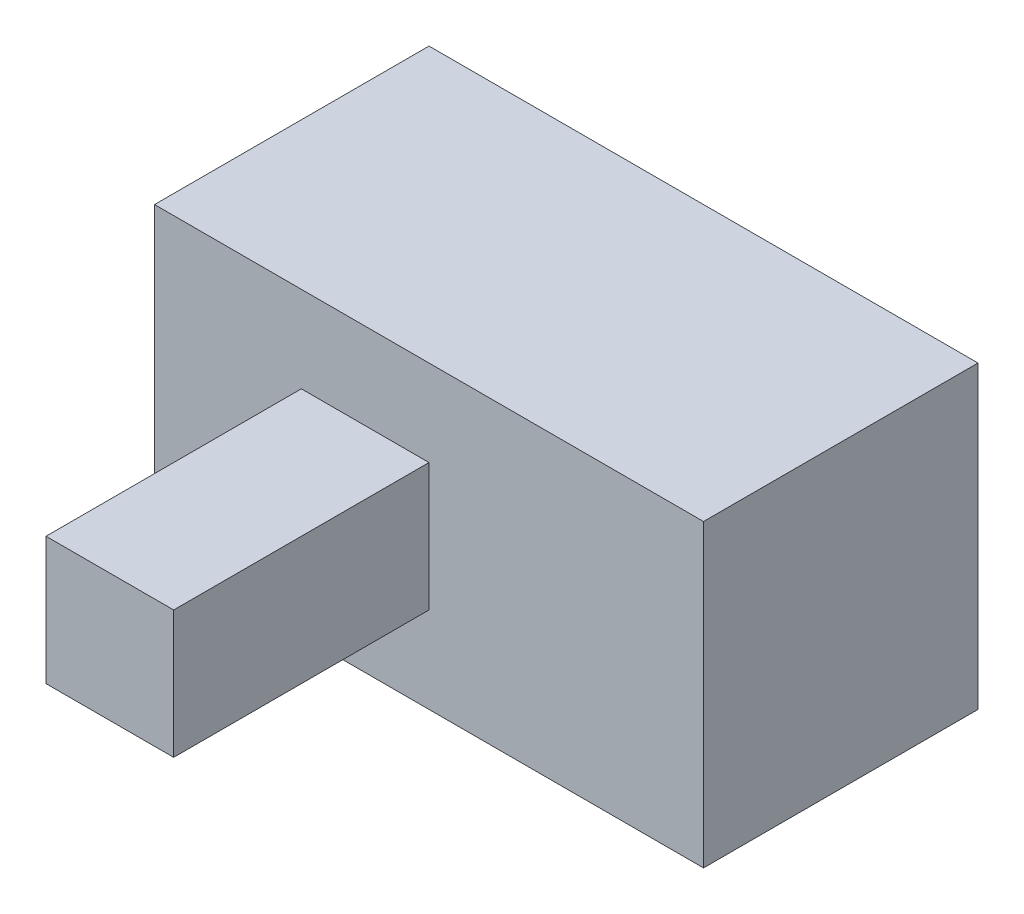
ISO-10303-21;
HEADER;
FILE_DESCRIPTION(('STEP AP214'),'2;1');
FILE_NAME('part.step','',(''),(''),'','','');
FILE_SCHEMA(('AUTOMOTIVE_DESIGN { 1 0 10303 214 1 1 1 1 }'));
ENDSEC;
DATA;
#1=APPLICATION_CONTEXT('core data for automotive mechanical design processes');
#2=APPLICATION_PROTOCOL_DEFINITION('international standard','automotive_design',2000,#1);
#3=PRODUCT_CONTEXT('',#1,'mechanical');
#4=PRODUCT('Part','Part','',(#3));
#5=PRODUCT_RELATED_PRODUCT_CATEGORY('part','',(#4));
#6=PRODUCT_DEFINITION_FORMATION('','',#4);
#7=PRODUCT_DEFINITION_CONTEXT('part definition',#1,'design');
#8=PRODUCT_DEFINITION('design','',#6,#7);
#9=PRODUCT_DEFINITION_SHAPE('','',#8);
#10=(LENGTH_UNIT() NAMED_UNIT(*) SI_UNIT(.MILLI.,.METRE.));
#11=(NAMED_UNIT(*) PLANE_ANGLE_UNIT() SI_UNIT($,.RADIAN.));
#12=(NAMED_UNIT(*) SI_UNIT($,.STERADIAN.) SOLID_ANGLE_UNIT());
#13=UNCERTAINTY_MEASURE_WITH_UNIT(LENGTH_MEASURE(1.E-05),#10,'distance_accuracy_value','');
#14=(GEOMETRIC_REPRESENTATION_CONTEXT(3) GLOBAL_UNCERTAINTY_ASSIGNED_CONTEXT((#13)) GLOBAL_UNIT_ASSIGNED_CONTEXT((#10,
#11,#12)) REPRESENTATION_CONTEXT('',''));
#15=CARTESIAN_POINT('',(0.,0.,0.));
#16=DIRECTION('',(0.,0.,1.));
#17=DIRECTION('',(1.,0.,0.));
#18=AXIS2_PLACEMENT_3D('',#15,#16,#17);
#19=CARTESIAN_POINT('',(0.,0.,0.));
#20=DIRECTION('',(0.,-1.,0.));
#21=DIRECTION('',(0.,0.,-1.));
#22=AXIS2_PLACEMENT_3D('',#19,#20,#21);
#23=PLANE('',#22);
#24=CARTESIAN_POINT('',(0.,0.,0.));
#25=DIRECTION('',(0.,-1.,0.));
#26=DIRECTION('',(0.,0.,-1.));
#27=AXIS2_PLACEMENT_3D('',#24,#25,#26);
#28=CIRCLE('',#27,0.4);
#29=CARTESIAN_POINT('',(0.,0.,-0.4));
#30=VERTEX_POINT('',#29);
#31=EDGE_CURVE('E228',#30,#30,#28,.T.);
#32=ORIENTED_EDGE('',*,*,#31,.F.);
#33=EDGE_LOOP('',(#32));
#34=FACE_BOUND('',#33,.T.);
#35=DIRECTION('',(0.,0.,-1.));
#36=VECTOR('',#35,1.);
#37=CARTESIAN_POINT('',(4.3,0.,2.15));
#38=LINE('',#37,#36);
#39=CARTESIAN_POINT('',(4.3,0.,2.15));
#40=VERTEX_POINT('',#39);
#41=CARTESIAN_POINT('',(4.3,0.,-2.15));
#42=VERTEX_POINT('',#41);
#43=EDGE_CURVE('E119',#40,#42,#38,.T.);
#44=ORIENTED_EDGE('',*,*,#43,.F.);
#45=DIRECTION('',(1.,0.,0.));
#46=VECTOR('',#45,1.);
#47=CARTESIAN_POINT('',(-4.3,0.,2.15));
#48=LINE('',#47,#46);
#49=CARTESIAN_POINT('',(-4.3,0.,2.15));
#50=VERTEX_POINT('',#49);
#51=EDGE_CURVE('E132',#50,#40,#48,.T.);
#52=ORIENTED_EDGE('',*,*,#51,.F.);
#53=DIRECTION('',(0.,0.,1.));
#54=VECTOR('',#53,1.);
#55=CARTESIAN_POINT('',(-4.3,0.,2.15));
#56=LINE('',#55,#54);
#57=CARTESIAN_POINT('',(-4.3,0.,-2.15));
#58=VERTEX_POINT('',#57);
#59=EDGE_CURVE('E140',#58,#50,#56,.T.);
#60=ORIENTED_EDGE('',*,*,#59,.F.);
#61=DIRECTION('',(-1.,0.,0.));
#62=VECTOR('',#61,1.);
#63=CARTESIAN_POINT('',(-4.3,0.,-2.15));
#64=LINE('',#63,#62);
#65=EDGE_CURVE('E122',#42,#58,#64,.T.);
#66=ORIENTED_EDGE('',*,*,#65,.F.);
#67=EDGE_LOOP('',(#44,#52,#60,#66));
#68=FACE_BOUND('',#67,.T.);
#69=CARTESIAN_POINT('',(-2.,0.,0.));
#70=DIRECTION('',(0.,-1.,0.));
#71=DIRECTION('',(0.,0.,-1.));
#72=AXIS2_PLACEMENT_3D('',#69,#70,#71);
#73=CIRCLE('',#72,0.4);
#74=CARTESIAN_POINT('',(-2.,0.,-0.4));
#75=VERTEX_POINT('',#74);
#76=EDGE_CURVE('E238',#75,#75,#73,.T.);
#77=ORIENTED_EDGE('',*,*,#76,.F.);
#78=EDGE_LOOP('',(#77));
#79=FACE_BOUND('',#78,.T.);
#80=CARTESIAN_POINT('',(2.,0.,0.));
#81=DIRECTION('',(0.,-1.,0.));
#82=DIRECTION('',(0.,0.,-1.));
#83=AXIS2_PLACEMENT_3D('',#80,#81,#82);
#84=CIRCLE('',#83,0.4);
#85=CARTESIAN_POINT('',(2.,0.,-0.4));
#86=VERTEX_POINT('',#85);
#87=EDGE_CURVE('E229',#86,#86,#84,.T.);
#88=ORIENTED_EDGE('',*,*,#87,.F.);
#89=EDGE_LOOP('',(#88));
#90=FACE_BOUND('',#89,.T.);
#91=ADVANCED_FACE('F33',(#34,#68,#79,#90),#23,.T.);
#92=CARTESIAN_POINT('',(-4.3,4.7,2.15));
#93=DIRECTION('',(0.,0.,-1.));
#94=DIRECTION('',(-1.,0.,0.));
#95=AXIS2_PLACEMENT_3D('',#92,#93,#94);
#96=PLANE('',#95);
#97=ORIENTED_EDGE('',*,*,#51,.T.);
#98=DIRECTION('',(0.,-1.,0.));
#99=VECTOR('',#98,1.);
#100=CARTESIAN_POINT('',(4.3,4.7,2.15));
#101=LINE('',#100,#99);
#102=CARTESIAN_POINT('',(4.3,4.7,2.15));
#103=VERTEX_POINT('',#102);
#104=EDGE_CURVE('E137',#103,#40,#101,.T.);
#105=ORIENTED_EDGE('',*,*,#104,.F.);
#106=DIRECTION('',(1.,0.,0.));
#107=VECTOR('',#106,1.);
#108=CARTESIAN_POINT('',(-4.3,4.7,2.15));
#109=LINE('',#108,#107);
#110=CARTESIAN_POINT('',(-4.3,4.7,2.15));
#111=VERTEX_POINT('',#110);
#112=EDGE_CURVE('E136',#111,#103,#109,.T.);
#113=ORIENTED_EDGE('',*,*,#112,.F.);
#114=DIRECTION('',(0.,-1.,0.));
#115=VECTOR('',#114,1.);
#116=CARTESIAN_POINT('',(-4.3,4.7,2.15));
#117=LINE('',#116,#115);
#118=EDGE_CURVE('E145',#111,#50,#117,.T.);
#119=ORIENTED_EDGE('',*,*,#118,.T.);
#120=EDGE_LOOP('',(#97,#105,#113,#119));
#121=FACE_BOUND('',#120,.T.);
#122=DIRECTION('',(0.,1.,0.));
#123=VECTOR('',#122,1.);
#124=CARTESIAN_POINT('',(0.,1.35,2.15));
#125=LINE('',#124,#123);
#126=CARTESIAN_POINT('',(0.,1.35,2.15));
#127=VERTEX_POINT('',#126);
#128=CARTESIAN_POINT('',(0.,3.35,2.15));
#129=VERTEX_POINT('',#128);
#130=EDGE_CURVE('E118',#127,#129,#125,.T.);
#131=ORIENTED_EDGE('',*,*,#130,.F.);
#132=DIRECTION('',(1.,0.,0.));
#133=VECTOR('',#132,1.);
#134=CARTESIAN_POINT('',(-2.,1.35,2.15));
#135=LINE('',#134,#133);
#136=CARTESIAN_POINT('',(-2.,1.35,2.15));
#137=VERTEX_POINT('',#136);
#138=EDGE_CURVE('E115',#137,#127,#135,.T.);
#139=ORIENTED_EDGE('',*,*,#138,.F.);
#140=DIRECTION('',(0.,-1.,0.));
#141=VECTOR('',#140,1.);
#142=CARTESIAN_POINT('',(-2.,1.35,2.15));
#143=LINE('',#142,#141);
#144=CARTESIAN_POINT('',(-2.,3.35,2.15));
#145=VERTEX_POINT('',#144);
#146=EDGE_CURVE('E53',#145,#137,#143,.T.);
#147=ORIENTED_EDGE('',*,*,#146,.F.);
#148=DIRECTION('',(-1.,0.,0.));
#149=VECTOR('',#148,1.);
#150=CARTESIAN_POINT('',(-2.,3.35,2.15));
#151=LINE('',#150,#149);
#152=EDGE_CURVE('E48',#129,#145,#151,.T.);
#153=ORIENTED_EDGE('',*,*,#152,.F.);
#154=EDGE_LOOP('',(#131,#139,#147,#153));
#155=FACE_BOUND('',#154,.T.);
#156=ADVANCED_FACE('F161',(#121,#155),#96,.F.);
#157=CARTESIAN_POINT('',(4.3,4.7,2.15));
#158=DIRECTION('',(-1.,0.,0.));
#159=DIRECTION('',(0.,0.,1.));
#160=AXIS2_PLACEMENT_3D('',#157,#158,#159);
#161=PLANE('',#160);
#162=ORIENTED_EDGE('',*,*,#43,.T.);
#163=DIRECTION('',(0.,-1.,0.));
#164=VECTOR('',#163,1.);
#165=CARTESIAN_POINT('',(4.3,4.7,-2.15));
#166=LINE('',#165,#164);
#167=CARTESIAN_POINT('',(4.3,4.7,-2.15));
#168=VERTEX_POINT('',#167);
#169=EDGE_CURVE('E11',#168,#42,#166,.T.);
#170=ORIENTED_EDGE('',*,*,#169,.F.);
#171=DIRECTION('',(0.,0.,-1.));
#172=VECTOR('',#171,1.);
#173=CARTESIAN_POINT('',(4.3,4.7,2.15));
#174=LINE('',#173,#172);
#175=EDGE_CURVE('E128',#103,#168,#174,.T.);
#176=ORIENTED_EDGE('',*,*,#175,.F.);
#177=ORIENTED_EDGE('',*,*,#104,.T.);
#178=EDGE_LOOP('',(#162,#170,#176,#177));
#179=FACE_BOUND('',#178,.T.);
#180=ADVANCED_FACE('F35',(#179),#161,.F.);
#181=CARTESIAN_POINT('',(-4.3,4.7,-2.15));
#182=DIRECTION('',(0.,0.,1.));
#183=DIRECTION('',(1.,0.,0.));
#184=AXIS2_PLACEMENT_3D('',#181,#182,#183);
#185=PLANE('',#184);
#186=ORIENTED_EDGE('',*,*,#65,.T.);
#187=DIRECTION('',(0.,-1.,0.));
#188=VECTOR('',#187,1.);
#189=CARTESIAN_POINT('',(-4.3,4.7,-2.15));
#190=LINE('',#189,#188);
#191=CARTESIAN_POINT('',(-4.3,4.7,-2.15));
#192=VERTEX_POINT('',#191);
#193=EDGE_CURVE('E41',#192,#58,#190,.T.);
#194=ORIENTED_EDGE('',*,*,#193,.F.);
#195=DIRECTION('',(-1.,0.,0.));
#196=VECTOR('',#195,1.);
#197=CARTESIAN_POINT('',(-4.3,4.7,-2.15));
#198=LINE('',#197,#196);
#199=EDGE_CURVE('E131',#168,#192,#198,.T.);
#200=ORIENTED_EDGE('',*,*,#199,.F.);
#201=ORIENTED_EDGE('',*,*,#169,.T.);
#202=EDGE_LOOP('',(#186,#194,#200,#201));
#203=FACE_BOUND('',#202,.T.);
#204=ADVANCED_FACE('F168',(#203),#185,.F.);
#205=CARTESIAN_POINT('',(-4.3,4.7,2.15));
#206=DIRECTION('',(1.,0.,0.));
#207=DIRECTION('',(0.,0.,-1.));
#208=AXIS2_PLACEMENT_3D('',#205,#206,#207);
#209=PLANE('',#208);
#210=ORIENTED_EDGE('',*,*,#59,.T.);
#211=ORIENTED_EDGE('',*,*,#118,.F.);
#212=DIRECTION('',(0.,0.,1.));
#213=VECTOR('',#212,1.);
#214=CARTESIAN_POINT('',(-4.3,4.7,2.15));
#215=LINE('',#214,#213);
#216=EDGE_CURVE('E134',#192,#111,#215,.T.);
#217=ORIENTED_EDGE('',*,*,#216,.F.);
#218=ORIENTED_EDGE('',*,*,#193,.T.);
#219=EDGE_LOOP('',(#210,#211,#217,#218));
#220=FACE_BOUND('',#219,.T.);
#221=ADVANCED_FACE('F152',(#220),#209,.F.);
#222=CARTESIAN_POINT('',(0.,4.7,0.));
#223=DIRECTION('',(0.,-1.,0.));
#224=DIRECTION('',(0.,0.,-1.));
#225=AXIS2_PLACEMENT_3D('',#222,#223,#224);
#226=PLANE('',#225);
#227=ORIENTED_EDGE('',*,*,#175,.T.);
#228=ORIENTED_EDGE('',*,*,#199,.T.);
#229=ORIENTED_EDGE('',*,*,#216,.T.);
#230=ORIENTED_EDGE('',*,*,#112,.T.);
#231=EDGE_LOOP('',(#227,#228,#229,#230));
#232=FACE_BOUND('',#231,.T.);
#233=ADVANCED_FACE('F167',(#232),#226,.F.);
#234=CARTESIAN_POINT('',(0.,1.35,6.15));
#235=DIRECTION('',(-1.,0.,0.));
#236=DIRECTION('',(0.,0.,1.));
#237=AXIS2_PLACEMENT_3D('',#234,#235,#236);
#238=PLANE('',#237);
#239=ORIENTED_EDGE('',*,*,#130,.T.);
#240=DIRECTION('',(0.,0.,-1.));
#241=VECTOR('',#240,1.);
#242=CARTESIAN_POINT('',(0.,3.35,6.15));
#243=LINE('',#242,#241);
#244=CARTESIAN_POINT('',(0.,3.35,6.15));
#245=VERTEX_POINT('',#244);
#246=EDGE_CURVE('E99',#245,#129,#243,.T.);
#247=ORIENTED_EDGE('',*,*,#246,.F.);
#248=DIRECTION('',(0.,1.,0.));
#249=VECTOR('',#248,1.);
#250=CARTESIAN_POINT('',(0.,1.35,6.15));
#251=LINE('',#250,#249);
#252=CARTESIAN_POINT('',(0.,1.35,6.15));
#253=VERTEX_POINT('',#252);
#254=EDGE_CURVE('E106',#253,#245,#251,.T.);
#255=ORIENTED_EDGE('',*,*,#254,.F.);
#256=DIRECTION('',(0.,0.,-1.));
#257=VECTOR('',#256,1.);
#258=CARTESIAN_POINT('',(0.,1.35,6.15));
#259=LINE('',#258,#257);
#260=EDGE_CURVE('E247',#253,#127,#259,.T.);
#261=ORIENTED_EDGE('',*,*,#260,.T.);
#262=EDGE_LOOP('',(#239,#247,#255,#261));
#263=FACE_BOUND('',#262,.T.);
#264=ADVANCED_FACE('F117',(#263),#238,.F.);
#265=CARTESIAN_POINT('',(-2.,3.35,6.15));
#266=DIRECTION('',(0.,-1.,0.));
#267=DIRECTION('',(0.,0.,-1.));
#268=AXIS2_PLACEMENT_3D('',#265,#266,#267);
#269=PLANE('',#268);
#270=ORIENTED_EDGE('',*,*,#152,.T.);
#271=DIRECTION('',(0.,0.,-1.));
#272=VECTOR('',#271,1.);
#273=CARTESIAN_POINT('',(-2.,3.35,6.15));
#274=LINE('',#273,#272);
#275=CARTESIAN_POINT('',(-2.,3.35,6.15));
#276=VERTEX_POINT('',#275);
#277=EDGE_CURVE('E102',#276,#145,#274,.T.);
#278=ORIENTED_EDGE('',*,*,#277,.F.);
#279=DIRECTION('',(-1.,0.,0.));
#280=VECTOR('',#279,1.);
#281=CARTESIAN_POINT('',(-2.,3.35,6.15));
#282=LINE('',#281,#280);
#283=EDGE_CURVE('E95',#245,#276,#282,.T.);
#284=ORIENTED_EDGE('',*,*,#283,.F.);
#285=ORIENTED_EDGE('',*,*,#246,.T.);
#286=EDGE_LOOP('',(#270,#278,#284,#285));
#287=FACE_BOUND('',#286,.T.);
#288=ADVANCED_FACE('F97',(#287),#269,.F.);
#289=CARTESIAN_POINT('',(-2.,1.35,6.15));
#290=DIRECTION('',(1.,0.,0.));
#291=DIRECTION('',(0.,0.,-1.));
#292=AXIS2_PLACEMENT_3D('',#289,#290,#291);
#293=PLANE('',#292);
#294=ORIENTED_EDGE('',*,*,#146,.T.);
#295=DIRECTION('',(0.,0.,-1.));
#296=VECTOR('',#295,1.);
#297=CARTESIAN_POINT('',(-2.,1.35,6.15));
#298=LINE('',#297,#296);
#299=CARTESIAN_POINT('',(-2.,1.35,6.15));
#300=VERTEX_POINT('',#299);
#301=EDGE_CURVE('E124',#300,#137,#298,.T.);
#302=ORIENTED_EDGE('',*,*,#301,.F.);
#303=DIRECTION('',(0.,-1.,0.));
#304=VECTOR('',#303,1.);
#305=CARTESIAN_POINT('',(-2.,1.35,6.15));
#306=LINE('',#305,#304);
#307=EDGE_CURVE('E105',#276,#300,#306,.T.);
#308=ORIENTED_EDGE('',*,*,#307,.F.);
#309=ORIENTED_EDGE('',*,*,#277,.T.);
#310=EDGE_LOOP('',(#294,#302,#308,#309));
#311=FACE_BOUND('',#310,.T.);
#312=ADVANCED_FACE('F190',(#311),#293,.F.);
#313=CARTESIAN_POINT('',(-2.,1.35,6.15));
#314=DIRECTION('',(0.,1.,0.));
#315=DIRECTION('',(-1.,0.,0.));
#316=AXIS2_PLACEMENT_3D('',#313,#314,#315);
#317=PLANE('',#316);
#318=ORIENTED_EDGE('',*,*,#138,.T.);
#319=ORIENTED_EDGE('',*,*,#260,.F.);
#320=DIRECTION('',(1.,0.,0.));
#321=VECTOR('',#320,1.);
#322=CARTESIAN_POINT('',(-2.,1.35,6.15));
#323=LINE('',#322,#321);
#324=EDGE_CURVE('E111',#300,#253,#323,.T.);
#325=ORIENTED_EDGE('',*,*,#324,.F.);
#326=ORIENTED_EDGE('',*,*,#301,.T.);
#327=EDGE_LOOP('',(#318,#319,#325,#326));
#328=FACE_BOUND('',#327,.T.);
#329=ADVANCED_FACE('F193',(#328),#317,.F.);
#330=CARTESIAN_POINT('',(0.,0.,6.15));
#331=DIRECTION('',(0.,0.,-1.));
#332=DIRECTION('',(-1.,0.,0.));
#333=AXIS2_PLACEMENT_3D('',#330,#331,#332);
#334=PLANE('',#333);
#335=ORIENTED_EDGE('',*,*,#254,.T.);
#336=ORIENTED_EDGE('',*,*,#283,.T.);
#337=ORIENTED_EDGE('',*,*,#307,.T.);
#338=ORIENTED_EDGE('',*,*,#324,.T.);
#339=EDGE_LOOP('',(#335,#336,#337,#338));
#340=FACE_BOUND('',#339,.T.);
#341=ADVANCED_FACE('F109',(#340),#334,.F.);
#342=CARTESIAN_POINT('',(-2.,-1.5,0.));
#343=DIRECTION('',(0.,1.,0.));
#344=DIRECTION('',(0.,0.,1.));
#345=AXIS2_PLACEMENT_3D('',#342,#343,#344);
#346=CYLINDRICAL_SURFACE('',#345,0.4);
#347=CARTESIAN_POINT('',(-2.,-1.5,0.));
#348=DIRECTION('',(0.,-1.,0.));
#349=DIRECTION('',(0.,0.,-1.));
#350=AXIS2_PLACEMENT_3D('',#347,#348,#349);
#351=CIRCLE('',#350,0.4);
#352=CARTESIAN_POINT('',(-2.,-1.5,-0.4));
#353=VERTEX_POINT('',#352);
#354=EDGE_CURVE('E240',#353,#353,#351,.T.);
#355=ORIENTED_EDGE('',*,*,#354,.F.);
#356=EDGE_LOOP('',(#355));
#357=FACE_BOUND('',#356,.T.);
#358=ORIENTED_EDGE('',*,*,#76,.T.);
#359=EDGE_LOOP('',(#358));
#360=FACE_BOUND('',#359,.T.);
#361=ADVANCED_FACE('F200',(#357,#360),#346,.T.);
#362=CARTESIAN_POINT('',(-2.,-1.5,0.));
#363=DIRECTION('',(0.,-1.,0.));
#364=DIRECTION('',(0.,0.,-1.));
#365=AXIS2_PLACEMENT_3D('',#362,#363,#364);
#366=PLANE('',#365);
#367=ORIENTED_EDGE('',*,*,#354,.T.);
#368=EDGE_LOOP('',(#367));
#369=FACE_BOUND('',#368,.T.);
#370=ADVANCED_FACE('F203',(#369),#366,.T.);
#371=CARTESIAN_POINT('',(0.,-1.5,0.));
#372=DIRECTION('',(0.,1.,0.));
#373=DIRECTION('',(0.,0.,1.));
#374=AXIS2_PLACEMENT_3D('',#371,#372,#373);
#375=CYLINDRICAL_SURFACE('',#374,0.4);
#376=CARTESIAN_POINT('',(0.,-1.5,0.));
#377=DIRECTION('',(0.,-1.,0.));
#378=DIRECTION('',(0.,0.,-1.));
#379=AXIS2_PLACEMENT_3D('',#376,#377,#378);
#380=CIRCLE('',#379,0.4);
#381=CARTESIAN_POINT('',(0.,-1.5,-0.4));
#382=VERTEX_POINT('',#381);
#383=EDGE_CURVE('E232',#382,#382,#380,.T.);
#384=ORIENTED_EDGE('',*,*,#383,.F.);
#385=EDGE_LOOP('',(#384));
#386=FACE_BOUND('',#385,.T.);
#387=ORIENTED_EDGE('',*,*,#31,.T.);
#388=EDGE_LOOP('',(#387));
#389=FACE_BOUND('',#388,.T.);
#390=ADVANCED_FACE('F207',(#386,#389),#375,.T.);
#391=CARTESIAN_POINT('',(0.,-1.5,0.));
#392=DIRECTION('',(0.,-1.,0.));
#393=DIRECTION('',(0.,0.,-1.));
#394=AXIS2_PLACEMENT_3D('',#391,#392,#393);
#395=PLANE('',#394);
#396=ORIENTED_EDGE('',*,*,#383,.T.);
#397=EDGE_LOOP('',(#396));
#398=FACE_BOUND('',#397,.T.);
#399=ADVANCED_FACE('F211',(#398),#395,.T.);
#400=CARTESIAN_POINT('',(2.,-1.5,0.));
#401=DIRECTION('',(0.,1.,0.));
#402=DIRECTION('',(0.,0.,1.));
#403=AXIS2_PLACEMENT_3D('',#400,#401,#402);
#404=CYLINDRICAL_SURFACE('',#403,0.4);
#405=CARTESIAN_POINT('',(2.,-1.5,0.));
#406=DIRECTION('',(0.,-1.,0.));
#407=DIRECTION('',(0.,0.,-1.));
#408=AXIS2_PLACEMENT_3D('',#405,#406,#407);
#409=CIRCLE('',#408,0.4);
#410=CARTESIAN_POINT('',(2.,-1.5,-0.4));
#411=VERTEX_POINT('',#410);
#412=EDGE_CURVE('E227',#411,#411,#409,.T.);
#413=ORIENTED_EDGE('',*,*,#412,.F.);
#414=EDGE_LOOP('',(#413));
#415=FACE_BOUND('',#414,.T.);
#416=ORIENTED_EDGE('',*,*,#87,.T.);
#417=EDGE_LOOP('',(#416));
#418=FACE_BOUND('',#417,.T.);
#419=ADVANCED_FACE('F215',(#415,#418),#404,.T.);
#420=CARTESIAN_POINT('',(2.,-1.5,0.));
#421=DIRECTION('',(0.,-1.,0.));
#422=DIRECTION('',(0.,0.,-1.));
#423=AXIS2_PLACEMENT_3D('',#420,#421,#422);
#424=PLANE('',#423);
#425=ORIENTED_EDGE('',*,*,#412,.T.);
#426=EDGE_LOOP('',(#425));
#427=FACE_BOUND('',#426,.T.);
#428=ADVANCED_FACE('F219',(#427),#424,.T.);
#429=CLOSED_SHELL('',(#91,#156,#180,#204,#221,#233,#264,#288,#312,#329,#341,#361,#370,#390,#399,
#419,#428));
#430=MANIFOLD_SOLID_BREP('B2',#429);
#431=ADVANCED_BREP_SHAPE_REPRESENTATION('',(#18,#430),#14);
#432=SHAPE_DEFINITION_REPRESENTATION(#9,#431);
ENDSEC;
END-ISO-10303-21;
